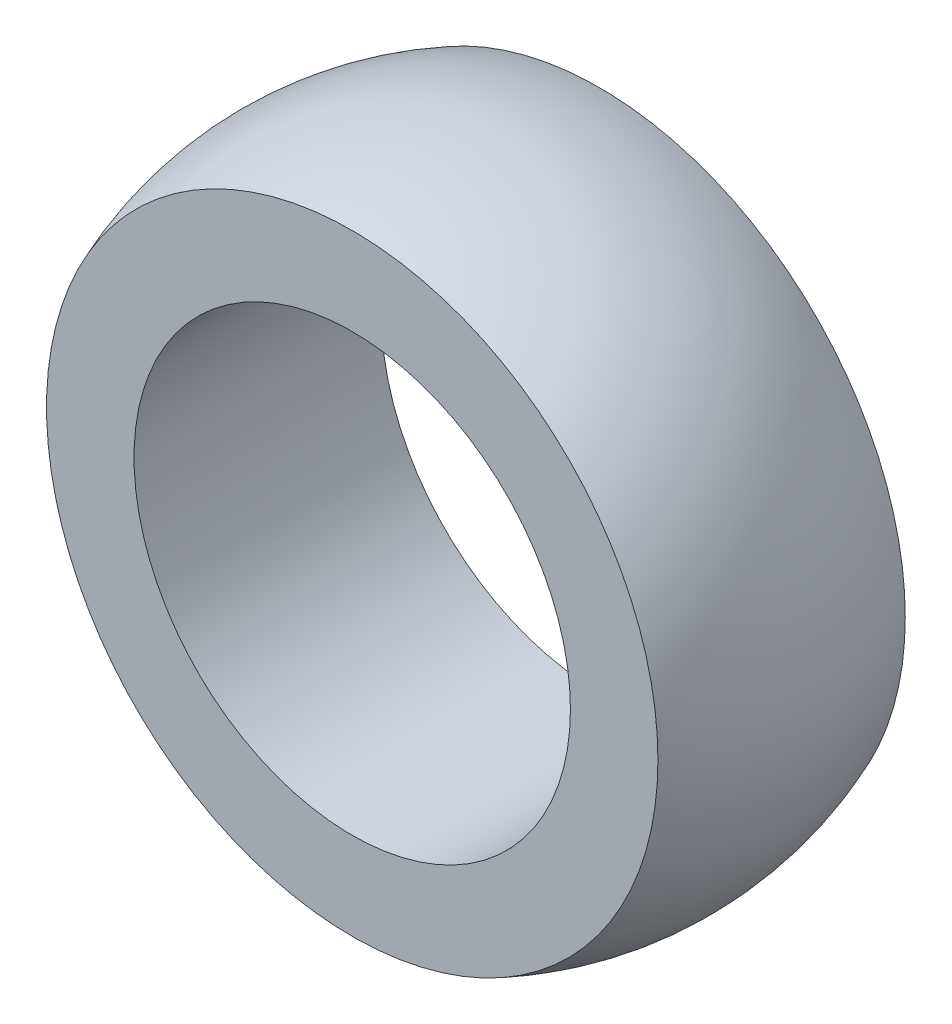
ISO-10303-21;
HEADER;
FILE_DESCRIPTION(('STEP AP214'),'2;1');
FILE_NAME('part.step','',(''),(''),'','','');
FILE_SCHEMA(('AUTOMOTIVE_DESIGN { 1 0 10303 214 1 1 1 1 }'));
ENDSEC;
DATA;
#1=APPLICATION_CONTEXT('core data for automotive mechanical design processes');
#2=APPLICATION_PROTOCOL_DEFINITION('international standard','automotive_design',2000,#1);
#3=PRODUCT_CONTEXT('',#1,'mechanical');
#4=PRODUCT('Part','Part','',(#3));
#5=PRODUCT_RELATED_PRODUCT_CATEGORY('part','',(#4));
#6=PRODUCT_DEFINITION_FORMATION('','',#4);
#7=PRODUCT_DEFINITION_CONTEXT('part definition',#1,'design');
#8=PRODUCT_DEFINITION('design','',#6,#7);
#9=PRODUCT_DEFINITION_SHAPE('','',#8);
#10=(LENGTH_UNIT() NAMED_UNIT(*) SI_UNIT(.MILLI.,.METRE.));
#11=(NAMED_UNIT(*) PLANE_ANGLE_UNIT() SI_UNIT($,.RADIAN.));
#12=(NAMED_UNIT(*) SI_UNIT($,.STERADIAN.) SOLID_ANGLE_UNIT());
#13=UNCERTAINTY_MEASURE_WITH_UNIT(LENGTH_MEASURE(1.E-05),#10,'distance_accuracy_value','');
#14=(GEOMETRIC_REPRESENTATION_CONTEXT(3) GLOBAL_UNCERTAINTY_ASSIGNED_CONTEXT((#13)) GLOBAL_UNIT_ASSIGNED_CONTEXT((#10,
#11,#12)) REPRESENTATION_CONTEXT('',''));
#15=CARTESIAN_POINT('',(0.,0.,0.));
#16=DIRECTION('',(0.,0.,1.));
#17=DIRECTION('',(1.,0.,0.));
#18=AXIS2_PLACEMENT_3D('',#15,#16,#17);
#19=CARTESIAN_POINT('',(0.,0.,0.));
#20=DIRECTION('',(0.,1.,0.));
#21=DIRECTION('',(1.,0.,0.));
#22=AXIS2_PLACEMENT_3D('',#19,#20,#21);
#23=SPHERICAL_SURFACE('',#22,12.);
#24=CARTESIAN_POINT('',(0.,0.,0.));
#25=DIRECTION('',(0.,0.,1.));
#26=DIRECTION('',(1.,0.,0.));
#27=AXIS2_PLACEMENT_3D('',#24,#25,#26);
#28=SPHERICAL_SURFACE('',#27,12.);
#29=CARTESIAN_POINT('',(0.,0.,4.5));
#30=DIRECTION('',(0.,0.,1.));
#31=DIRECTION('',(1.,0.,0.));
#32=AXIS2_PLACEMENT_3D('',#29,#30,#31);
#33=CIRCLE('',#32,11.1242977306435);
#34=CARTESIAN_POINT('',(11.1242977306435,0.,4.5));
#35=VERTEX_POINT('',#34);
#36=EDGE_CURVE('E45',#35,#35,#33,.T.);
#37=ORIENTED_EDGE('',*,*,#36,.F.);
#38=EDGE_LOOP('',(#37));
#39=FACE_BOUND('',#38,.T.);
#40=CARTESIAN_POINT('',(0.,0.,-4.5));
#41=DIRECTION('',(0.,0.,-1.));
#42=DIRECTION('',(-1.,0.,0.));
#43=AXIS2_PLACEMENT_3D('',#40,#41,#42);
#44=CIRCLE('',#43,11.1242977306435);
#45=CARTESIAN_POINT('',(-11.1242977306435,0.,-4.5));
#46=VERTEX_POINT('',#45);
#47=EDGE_CURVE('E11',#46,#46,#44,.T.);
#48=ORIENTED_EDGE('',*,*,#47,.F.);
#49=EDGE_LOOP('',(#48));
#50=FACE_BOUND('',#49,.T.);
#51=ADVANCED_FACE('F38',(#39,#50),#28,.T.);
#52=CARTESIAN_POINT('',(14.5649925781208,-12.,4.5));
#53=DIRECTION('',(0.,0.,1.));
#54=DIRECTION('',(1.,0.,0.));
#55=AXIS2_PLACEMENT_3D('',#52,#53,#54);
#56=PLANE('',#55);
#57=CARTESIAN_POINT('',(0.,0.,4.5));
#58=DIRECTION('',(0.,0.,1.));
#59=DIRECTION('',(1.,0.,0.));
#60=AXIS2_PLACEMENT_3D('',#57,#58,#59);
#61=CIRCLE('',#60,7.94);
#62=CARTESIAN_POINT('',(7.94,0.,4.5));
#63=VERTEX_POINT('',#62);
#64=EDGE_CURVE('E51',#63,#63,#61,.T.);
#65=ORIENTED_EDGE('',*,*,#64,.F.);
#66=EDGE_LOOP('',(#65));
#67=FACE_BOUND('',#66,.T.);
#68=ORIENTED_EDGE('',*,*,#36,.T.);
#69=EDGE_LOOP('',(#68));
#70=FACE_BOUND('',#69,.T.);
#71=ADVANCED_FACE('F62',(#67,#70),#56,.T.);
#72=CARTESIAN_POINT('',(14.5649925781208,-12.,-4.5));
#73=DIRECTION('',(0.,0.,-1.));
#74=DIRECTION('',(-1.,0.,0.));
#75=AXIS2_PLACEMENT_3D('',#72,#73,#74);
#76=PLANE('',#75);
#77=CARTESIAN_POINT('',(0.,0.,-4.5));
#78=DIRECTION('',(0.,0.,-1.));
#79=DIRECTION('',(-1.,0.,0.));
#80=AXIS2_PLACEMENT_3D('',#77,#78,#79);
#81=CIRCLE('',#80,7.94);
#82=CARTESIAN_POINT('',(-7.94,0.,-4.5));
#83=VERTEX_POINT('',#82);
#84=EDGE_CURVE('E41',#83,#83,#81,.T.);
#85=ORIENTED_EDGE('',*,*,#84,.F.);
#86=EDGE_LOOP('',(#85));
#87=FACE_BOUND('',#86,.T.);
#88=ORIENTED_EDGE('',*,*,#47,.T.);
#89=EDGE_LOOP('',(#88));
#90=FACE_BOUND('',#89,.T.);
#91=ADVANCED_FACE('F60',(#87,#90),#76,.T.);
#92=CARTESIAN_POINT('',(0.,0.,-25.5));
#93=DIRECTION('',(0.,0.,1.));
#94=DIRECTION('',(1.,0.,0.));
#95=AXIS2_PLACEMENT_3D('',#92,#93,#94);
#96=CYLINDRICAL_SURFACE('',#95,7.94);
#97=ORIENTED_EDGE('',*,*,#84,.T.);
#98=EDGE_LOOP('',(#97));
#99=FACE_BOUND('',#98,.T.);
#100=ORIENTED_EDGE('',*,*,#64,.T.);
#101=EDGE_LOOP('',(#100));
#102=FACE_BOUND('',#101,.T.);
#103=ADVANCED_FACE('F58',(#99,#102),#96,.F.);
#104=CLOSED_SHELL('',(#51,#71,#91,#103));
#105=MANIFOLD_SOLID_BREP('B2',#104);
#106=ADVANCED_BREP_SHAPE_REPRESENTATION('',(#18,#105),#14);
#107=SHAPE_DEFINITION_REPRESENTATION(#9,#106);
ENDSEC;
END-ISO-10303-21;
